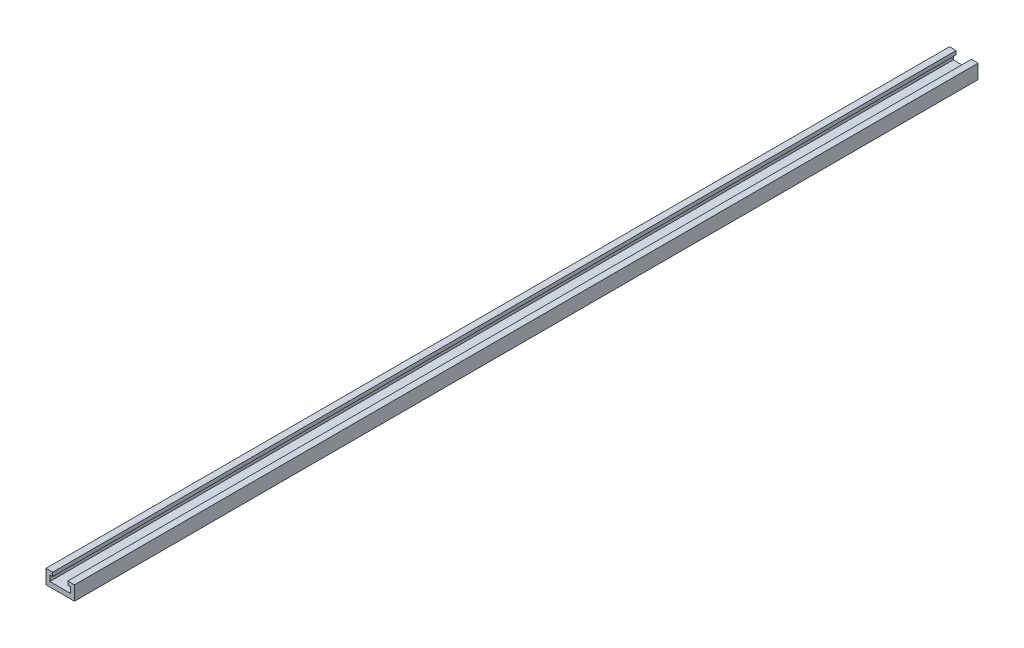
ISO-10303-21;
HEADER;
FILE_DESCRIPTION(('STEP AP214'),'2;1');
FILE_NAME('part.step','',(''),(''),'','','');
FILE_SCHEMA(('AUTOMOTIVE_DESIGN { 1 0 10303 214 1 1 1 1 }'));
ENDSEC;
DATA;
#1=APPLICATION_CONTEXT('core data for automotive mechanical design processes');
#2=APPLICATION_PROTOCOL_DEFINITION('international standard','automotive_design',2000,#1);
#3=PRODUCT_CONTEXT('',#1,'mechanical');
#4=PRODUCT('Part','Part','',(#3));
#5=PRODUCT_RELATED_PRODUCT_CATEGORY('part','',(#4));
#6=PRODUCT_DEFINITION_FORMATION('','',#4);
#7=PRODUCT_DEFINITION_CONTEXT('part definition',#1,'design');
#8=PRODUCT_DEFINITION('design','',#6,#7);
#9=PRODUCT_DEFINITION_SHAPE('','',#8);
#10=(LENGTH_UNIT() NAMED_UNIT(*) SI_UNIT(.MILLI.,.METRE.));
#11=(NAMED_UNIT(*) PLANE_ANGLE_UNIT() SI_UNIT($,.RADIAN.));
#12=(NAMED_UNIT(*) SI_UNIT($,.STERADIAN.) SOLID_ANGLE_UNIT());
#13=UNCERTAINTY_MEASURE_WITH_UNIT(LENGTH_MEASURE(1.E-05),#10,'distance_accuracy_value','');
#14=(GEOMETRIC_REPRESENTATION_CONTEXT(3) GLOBAL_UNCERTAINTY_ASSIGNED_CONTEXT((#13)) GLOBAL_UNIT_ASSIGNED_CONTEXT((#10,
#11,#12)) REPRESENTATION_CONTEXT('',''));
#15=CARTESIAN_POINT('',(0.,0.,0.));
#16=DIRECTION('',(0.,0.,1.));
#17=DIRECTION('',(1.,0.,0.));
#18=AXIS2_PLACEMENT_3D('',#15,#16,#17);
#19=CARTESIAN_POINT('',(0.,0.,301.625));
#20=DIRECTION('',(1.,0.,0.));
#21=DIRECTION('',(0.,0.,-1.));
#22=AXIS2_PLACEMENT_3D('',#19,#20,#21);
#23=PLANE('',#22);
#24=DIRECTION('',(0.,-1.,0.));
#25=VECTOR('',#24,1.);
#26=CARTESIAN_POINT('',(0.,0.,-301.625));
#27=LINE('',#26,#25);
#28=CARTESIAN_POINT('',(0.,9.525,-301.625));
#29=VERTEX_POINT('',#28);
#30=CARTESIAN_POINT('',(0.,0.,-301.625));
#31=VERTEX_POINT('',#30);
#32=EDGE_CURVE('E155',#29,#31,#27,.T.);
#33=ORIENTED_EDGE('',*,*,#32,.T.);
#34=DIRECTION('',(0.,0.,-1.));
#35=VECTOR('',#34,1.);
#36=CARTESIAN_POINT('',(0.,0.,301.625));
#37=LINE('',#36,#35);
#38=CARTESIAN_POINT('',(0.,0.,301.625));
#39=VERTEX_POINT('',#38);
#40=EDGE_CURVE('E11',#39,#31,#37,.T.);
#41=ORIENTED_EDGE('',*,*,#40,.F.);
#42=DIRECTION('',(0.,-1.,0.));
#43=VECTOR('',#42,1.);
#44=CARTESIAN_POINT('',(0.,0.,301.625));
#45=LINE('',#44,#43);
#46=CARTESIAN_POINT('',(0.,9.525,301.625));
#47=VERTEX_POINT('',#46);
#48=EDGE_CURVE('E178',#47,#39,#45,.T.);
#49=ORIENTED_EDGE('',*,*,#48,.F.);
#50=DIRECTION('',(0.,0.,-1.));
#51=VECTOR('',#50,1.);
#52=CARTESIAN_POINT('',(0.,9.525,301.625));
#53=LINE('',#52,#51);
#54=EDGE_CURVE('E151',#47,#29,#53,.T.);
#55=ORIENTED_EDGE('',*,*,#54,.T.);
#56=EDGE_LOOP('',(#33,#41,#49,#55));
#57=FACE_BOUND('',#56,.T.);
#58=ADVANCED_FACE('F34',(#57),#23,.F.);
#59=CARTESIAN_POINT('',(0.,0.,301.625));
#60=DIRECTION('',(0.,1.,0.));
#61=DIRECTION('',(0.,0.,1.));
#62=AXIS2_PLACEMENT_3D('',#59,#60,#61);
#63=PLANE('',#62);
#64=DIRECTION('',(1.,0.,0.));
#65=VECTOR('',#64,1.);
#66=CARTESIAN_POINT('',(0.,0.,-301.625));
#67=LINE('',#66,#65);
#68=CARTESIAN_POINT('',(19.05,0.,-301.625));
#69=VERTEX_POINT('',#68);
#70=EDGE_CURVE('E158',#31,#69,#67,.T.);
#71=ORIENTED_EDGE('',*,*,#70,.T.);
#72=DIRECTION('',(0.,0.,-1.));
#73=VECTOR('',#72,1.);
#74=CARTESIAN_POINT('',(19.05,0.,301.625));
#75=LINE('',#74,#73);
#76=CARTESIAN_POINT('',(19.05,0.,301.625));
#77=VERTEX_POINT('',#76);
#78=EDGE_CURVE('E42',#77,#69,#75,.T.);
#79=ORIENTED_EDGE('',*,*,#78,.F.);
#80=DIRECTION('',(1.,0.,0.));
#81=VECTOR('',#80,1.);
#82=CARTESIAN_POINT('',(0.,0.,301.625));
#83=LINE('',#82,#81);
#84=EDGE_CURVE('E105',#39,#77,#83,.T.);
#85=ORIENTED_EDGE('',*,*,#84,.F.);
#86=ORIENTED_EDGE('',*,*,#40,.T.);
#87=EDGE_LOOP('',(#71,#79,#85,#86));
#88=FACE_BOUND('',#87,.T.);
#89=ADVANCED_FACE('F259',(#88),#63,.F.);
#90=CARTESIAN_POINT('',(19.05,0.,301.625));
#91=DIRECTION('',(-1.,0.,0.));
#92=DIRECTION('',(0.,-1.,0.));
#93=AXIS2_PLACEMENT_3D('',#90,#91,#92);
#94=PLANE('',#93);
#95=DIRECTION('',(0.,1.,0.));
#96=VECTOR('',#95,1.);
#97=CARTESIAN_POINT('',(19.05,0.,-301.625));
#98=LINE('',#97,#96);
#99=CARTESIAN_POINT('',(19.05,9.525,-301.625));
#100=VERTEX_POINT('',#99);
#101=EDGE_CURVE('E161',#69,#100,#98,.T.);
#102=ORIENTED_EDGE('',*,*,#101,.T.);
#103=DIRECTION('',(0.,0.,-1.));
#104=VECTOR('',#103,1.);
#105=CARTESIAN_POINT('',(19.05,9.525,301.625));
#106=LINE('',#105,#104);
#107=CARTESIAN_POINT('',(19.05,9.525,301.625));
#108=VERTEX_POINT('',#107);
#109=EDGE_CURVE('E200',#108,#100,#106,.T.);
#110=ORIENTED_EDGE('',*,*,#109,.F.);
#111=DIRECTION('',(0.,1.,0.));
#112=VECTOR('',#111,1.);
#113=CARTESIAN_POINT('',(19.05,0.,301.625));
#114=LINE('',#113,#112);
#115=EDGE_CURVE('E208',#77,#108,#114,.T.);
#116=ORIENTED_EDGE('',*,*,#115,.F.);
#117=ORIENTED_EDGE('',*,*,#78,.T.);
#118=EDGE_LOOP('',(#102,#110,#116,#117));
#119=FACE_BOUND('',#118,.T.);
#120=ADVANCED_FACE('F206',(#119),#94,.F.);
#121=CARTESIAN_POINT('',(14.605,9.525,301.625));
#122=DIRECTION('',(0.,-1.,0.));
#123=DIRECTION('',(0.,0.,-1.));
#124=AXIS2_PLACEMENT_3D('',#121,#122,#123);
#125=PLANE('',#124);
#126=DIRECTION('',(-1.,0.,0.));
#127=VECTOR('',#126,1.);
#128=CARTESIAN_POINT('',(14.605,9.525,-301.625));
#129=LINE('',#128,#127);
#130=CARTESIAN_POINT('',(14.605,9.525,-301.625));
#131=VERTEX_POINT('',#130);
#132=EDGE_CURVE('E163',#100,#131,#129,.T.);
#133=ORIENTED_EDGE('',*,*,#132,.T.);
#134=DIRECTION('',(0.,0.,-1.));
#135=VECTOR('',#134,1.);
#136=CARTESIAN_POINT('',(14.605,9.525,301.625));
#137=LINE('',#136,#135);
#138=CARTESIAN_POINT('',(14.605,9.525,301.625));
#139=VERTEX_POINT('',#138);
#140=EDGE_CURVE('E197',#139,#131,#137,.T.);
#141=ORIENTED_EDGE('',*,*,#140,.F.);
#142=DIRECTION('',(-1.,0.,0.));
#143=VECTOR('',#142,1.);
#144=CARTESIAN_POINT('',(14.605,9.525,301.625));
#145=LINE('',#144,#143);
#146=EDGE_CURVE('E226',#108,#139,#145,.T.);
#147=ORIENTED_EDGE('',*,*,#146,.F.);
#148=ORIENTED_EDGE('',*,*,#109,.T.);
#149=EDGE_LOOP('',(#133,#141,#147,#148));
#150=FACE_BOUND('',#149,.T.);
#151=ADVANCED_FACE('F217',(#150),#125,.F.);
#152=CARTESIAN_POINT('',(14.605,9.525,301.625));
#153=DIRECTION('',(1.,0.,0.));
#154=DIRECTION('',(0.,0.,-1.));
#155=AXIS2_PLACEMENT_3D('',#152,#153,#154);
#156=PLANE('',#155);
#157=DIRECTION('',(0.,-1.,0.));
#158=VECTOR('',#157,1.);
#159=CARTESIAN_POINT('',(14.605,9.525,-301.625));
#160=LINE('',#159,#158);
#161=CARTESIAN_POINT('',(14.605,6.985,-301.625));
#162=VERTEX_POINT('',#161);
#163=EDGE_CURVE('E165',#131,#162,#160,.T.);
#164=ORIENTED_EDGE('',*,*,#163,.T.);
#165=DIRECTION('',(0.,0.,-1.));
#166=VECTOR('',#165,1.);
#167=CARTESIAN_POINT('',(14.605,6.985,301.625));
#168=LINE('',#167,#166);
#169=CARTESIAN_POINT('',(14.605,6.985,301.625));
#170=VERTEX_POINT('',#169);
#171=EDGE_CURVE('E194',#170,#162,#168,.T.);
#172=ORIENTED_EDGE('',*,*,#171,.F.);
#173=DIRECTION('',(0.,-1.,0.));
#174=VECTOR('',#173,1.);
#175=CARTESIAN_POINT('',(14.605,9.525,301.625));
#176=LINE('',#175,#174);
#177=EDGE_CURVE('E223',#139,#170,#176,.T.);
#178=ORIENTED_EDGE('',*,*,#177,.F.);
#179=ORIENTED_EDGE('',*,*,#140,.T.);
#180=EDGE_LOOP('',(#164,#172,#178,#179));
#181=FACE_BOUND('',#180,.T.);
#182=ADVANCED_FACE('F221',(#181),#156,.F.);
#183=CARTESIAN_POINT('',(14.605,6.985,301.625));
#184=DIRECTION('',(0.,1.,0.));
#185=DIRECTION('',(0.,0.,1.));
#186=AXIS2_PLACEMENT_3D('',#183,#184,#185);
#187=PLANE('',#186);
#188=DIRECTION('',(1.,0.,0.));
#189=VECTOR('',#188,1.);
#190=CARTESIAN_POINT('',(14.605,6.985,-301.625));
#191=LINE('',#190,#189);
#192=CARTESIAN_POINT('',(16.51,6.985,-301.625));
#193=VERTEX_POINT('',#192);
#194=EDGE_CURVE('E167',#162,#193,#191,.T.);
#195=ORIENTED_EDGE('',*,*,#194,.T.);
#196=DIRECTION('',(0.,0.,-1.));
#197=VECTOR('',#196,1.);
#198=CARTESIAN_POINT('',(16.51,6.985,301.625));
#199=LINE('',#198,#197);
#200=CARTESIAN_POINT('',(16.51,6.985,301.625));
#201=VERTEX_POINT('',#200);
#202=EDGE_CURVE('E191',#201,#193,#199,.T.);
#203=ORIENTED_EDGE('',*,*,#202,.F.);
#204=DIRECTION('',(1.,0.,0.));
#205=VECTOR('',#204,1.);
#206=CARTESIAN_POINT('',(14.605,6.985,301.625));
#207=LINE('',#206,#205);
#208=EDGE_CURVE('E225',#170,#201,#207,.T.);
#209=ORIENTED_EDGE('',*,*,#208,.F.);
#210=ORIENTED_EDGE('',*,*,#171,.T.);
#211=EDGE_LOOP('',(#195,#203,#209,#210));
#212=FACE_BOUND('',#211,.T.);
#213=ADVANCED_FACE('F272',(#212),#187,.F.);
#214=CARTESIAN_POINT('',(16.51,6.985,301.625));
#215=DIRECTION('',(1.,0.,0.));
#216=DIRECTION('',(0.,0.,-1.));
#217=AXIS2_PLACEMENT_3D('',#214,#215,#216);
#218=PLANE('',#217);
#219=DIRECTION('',(0.,-1.,0.));
#220=VECTOR('',#219,1.);
#221=CARTESIAN_POINT('',(16.51,6.985,-301.625));
#222=LINE('',#221,#220);
#223=CARTESIAN_POINT('',(16.51,3.175,-301.625));
#224=VERTEX_POINT('',#223);
#225=EDGE_CURVE('E169',#193,#224,#222,.T.);
#226=ORIENTED_EDGE('',*,*,#225,.T.);
#227=DIRECTION('',(0.,0.,-1.));
#228=VECTOR('',#227,1.);
#229=CARTESIAN_POINT('',(16.51,3.175,301.625));
#230=LINE('',#229,#228);
#231=CARTESIAN_POINT('',(16.51,3.175,301.625));
#232=VERTEX_POINT('',#231);
#233=EDGE_CURVE('E188',#232,#224,#230,.T.);
#234=ORIENTED_EDGE('',*,*,#233,.F.);
#235=DIRECTION('',(0.,-1.,0.));
#236=VECTOR('',#235,1.);
#237=CARTESIAN_POINT('',(16.51,6.985,301.625));
#238=LINE('',#237,#236);
#239=EDGE_CURVE('E228',#201,#232,#238,.T.);
#240=ORIENTED_EDGE('',*,*,#239,.F.);
#241=ORIENTED_EDGE('',*,*,#202,.T.);
#242=EDGE_LOOP('',(#226,#234,#240,#241));
#243=FACE_BOUND('',#242,.T.);
#244=ADVANCED_FACE('F275',(#243),#218,.F.);
#245=CARTESIAN_POINT('',(2.54,3.175,301.625));
#246=DIRECTION('',(0.,-1.,0.));
#247=DIRECTION('',(0.,0.,-1.));
#248=AXIS2_PLACEMENT_3D('',#245,#246,#247);
#249=PLANE('',#248);
#250=DIRECTION('',(-1.,0.,0.));
#251=VECTOR('',#250,1.);
#252=CARTESIAN_POINT('',(2.54,3.175,-301.625));
#253=LINE('',#252,#251);
#254=CARTESIAN_POINT('',(2.54,3.175,-301.625));
#255=VERTEX_POINT('',#254);
#256=EDGE_CURVE('E171',#224,#255,#253,.T.);
#257=ORIENTED_EDGE('',*,*,#256,.T.);
#258=DIRECTION('',(0.,0.,-1.));
#259=VECTOR('',#258,1.);
#260=CARTESIAN_POINT('',(2.54,3.175,301.625));
#261=LINE('',#260,#259);
#262=CARTESIAN_POINT('',(2.54,3.175,301.625));
#263=VERTEX_POINT('',#262);
#264=EDGE_CURVE('E185',#263,#255,#261,.T.);
#265=ORIENTED_EDGE('',*,*,#264,.F.);
#266=DIRECTION('',(-1.,0.,0.));
#267=VECTOR('',#266,1.);
#268=CARTESIAN_POINT('',(2.54,3.175,301.625));
#269=LINE('',#268,#267);
#270=EDGE_CURVE('E234',#232,#263,#269,.T.);
#271=ORIENTED_EDGE('',*,*,#270,.F.);
#272=ORIENTED_EDGE('',*,*,#233,.T.);
#273=EDGE_LOOP('',(#257,#265,#271,#272));
#274=FACE_BOUND('',#273,.T.);
#275=ADVANCED_FACE('F240',(#274),#249,.F.);
#276=CARTESIAN_POINT('',(2.54,6.985,301.625));
#277=DIRECTION('',(-1.,0.,0.));
#278=DIRECTION('',(0.,-1.,0.));
#279=AXIS2_PLACEMENT_3D('',#276,#277,#278);
#280=PLANE('',#279);
#281=DIRECTION('',(0.,1.,0.));
#282=VECTOR('',#281,1.);
#283=CARTESIAN_POINT('',(2.54,6.985,-301.625));
#284=LINE('',#283,#282);
#285=CARTESIAN_POINT('',(2.54,6.985,-301.625));
#286=VERTEX_POINT('',#285);
#287=EDGE_CURVE('E173',#255,#286,#284,.T.);
#288=ORIENTED_EDGE('',*,*,#287,.T.);
#289=DIRECTION('',(0.,0.,-1.));
#290=VECTOR('',#289,1.);
#291=CARTESIAN_POINT('',(2.54,6.985,301.625));
#292=LINE('',#291,#290);
#293=CARTESIAN_POINT('',(2.54,6.985,301.625));
#294=VERTEX_POINT('',#293);
#295=EDGE_CURVE('E146',#294,#286,#292,.T.);
#296=ORIENTED_EDGE('',*,*,#295,.F.);
#297=DIRECTION('',(0.,1.,0.));
#298=VECTOR('',#297,1.);
#299=CARTESIAN_POINT('',(2.54,6.985,301.625));
#300=LINE('',#299,#298);
#301=EDGE_CURVE('E136',#263,#294,#300,.T.);
#302=ORIENTED_EDGE('',*,*,#301,.F.);
#303=ORIENTED_EDGE('',*,*,#264,.T.);
#304=EDGE_LOOP('',(#288,#296,#302,#303));
#305=FACE_BOUND('',#304,.T.);
#306=ADVANCED_FACE('F244',(#305),#280,.F.);
#307=CARTESIAN_POINT('',(4.445,6.985,301.625));
#308=DIRECTION('',(0.,1.,0.));
#309=DIRECTION('',(0.,0.,1.));
#310=AXIS2_PLACEMENT_3D('',#307,#308,#309);
#311=PLANE('',#310);
#312=DIRECTION('',(1.,0.,0.));
#313=VECTOR('',#312,1.);
#314=CARTESIAN_POINT('',(4.445,6.985,-301.625));
#315=LINE('',#314,#313);
#316=CARTESIAN_POINT('',(4.445,6.985,-301.625));
#317=VERTEX_POINT('',#316);
#318=EDGE_CURVE('E144',#286,#317,#315,.T.);
#319=ORIENTED_EDGE('',*,*,#318,.T.);
#320=DIRECTION('',(0.,0.,-1.));
#321=VECTOR('',#320,1.);
#322=CARTESIAN_POINT('',(4.445,6.985,301.625));
#323=LINE('',#322,#321);
#324=CARTESIAN_POINT('',(4.445,6.985,301.625));
#325=VERTEX_POINT('',#324);
#326=EDGE_CURVE('E141',#325,#317,#323,.T.);
#327=ORIENTED_EDGE('',*,*,#326,.F.);
#328=DIRECTION('',(1.,0.,0.));
#329=VECTOR('',#328,1.);
#330=CARTESIAN_POINT('',(4.445,6.985,301.625));
#331=LINE('',#330,#329);
#332=EDGE_CURVE('E130',#294,#325,#331,.T.);
#333=ORIENTED_EDGE('',*,*,#332,.F.);
#334=ORIENTED_EDGE('',*,*,#295,.T.);
#335=EDGE_LOOP('',(#319,#327,#333,#334));
#336=FACE_BOUND('',#335,.T.);
#337=ADVANCED_FACE('F142',(#336),#311,.F.);
#338=CARTESIAN_POINT('',(4.445,9.525,301.625));
#339=DIRECTION('',(-1.,0.,0.));
#340=DIRECTION('',(0.,0.,1.));
#341=AXIS2_PLACEMENT_3D('',#338,#339,#340);
#342=PLANE('',#341);
#343=DIRECTION('',(0.,1.,0.));
#344=VECTOR('',#343,1.);
#345=CARTESIAN_POINT('',(4.445,9.525,-301.625));
#346=LINE('',#345,#344);
#347=CARTESIAN_POINT('',(4.445,9.525,-301.625));
#348=VERTEX_POINT('',#347);
#349=EDGE_CURVE('E91',#317,#348,#346,.T.);
#350=ORIENTED_EDGE('',*,*,#349,.T.);
#351=DIRECTION('',(0.,0.,-1.));
#352=VECTOR('',#351,1.);
#353=CARTESIAN_POINT('',(4.445,9.525,301.625));
#354=LINE('',#353,#352);
#355=CARTESIAN_POINT('',(4.445,9.525,301.625));
#356=VERTEX_POINT('',#355);
#357=EDGE_CURVE('E147',#356,#348,#354,.T.);
#358=ORIENTED_EDGE('',*,*,#357,.F.);
#359=DIRECTION('',(0.,1.,0.));
#360=VECTOR('',#359,1.);
#361=CARTESIAN_POINT('',(4.445,9.525,301.625));
#362=LINE('',#361,#360);
#363=EDGE_CURVE('E134',#325,#356,#362,.T.);
#364=ORIENTED_EDGE('',*,*,#363,.F.);
#365=ORIENTED_EDGE('',*,*,#326,.T.);
#366=EDGE_LOOP('',(#350,#358,#364,#365));
#367=FACE_BOUND('',#366,.T.);
#368=ADVANCED_FACE('F149',(#367),#342,.F.);
#369=CARTESIAN_POINT('',(0.,9.525,301.625));
#370=DIRECTION('',(0.,-1.,0.));
#371=DIRECTION('',(0.,0.,-1.));
#372=AXIS2_PLACEMENT_3D('',#369,#370,#371);
#373=PLANE('',#372);
#374=DIRECTION('',(-1.,0.,0.));
#375=VECTOR('',#374,1.);
#376=CARTESIAN_POINT('',(0.,9.525,-301.625));
#377=LINE('',#376,#375);
#378=EDGE_CURVE('E97',#348,#29,#377,.T.);
#379=ORIENTED_EDGE('',*,*,#378,.T.);
#380=ORIENTED_EDGE('',*,*,#54,.F.);
#381=DIRECTION('',(-1.,0.,0.));
#382=VECTOR('',#381,1.);
#383=CARTESIAN_POINT('',(0.,9.525,301.625));
#384=LINE('',#383,#382);
#385=EDGE_CURVE('E50',#356,#47,#384,.T.);
#386=ORIENTED_EDGE('',*,*,#385,.F.);
#387=ORIENTED_EDGE('',*,*,#357,.T.);
#388=EDGE_LOOP('',(#379,#380,#386,#387));
#389=FACE_BOUND('',#388,.T.);
#390=ADVANCED_FACE('F248',(#389),#373,.F.);
#391=CARTESIAN_POINT('',(0.,0.,301.625));
#392=DIRECTION('',(0.,0.,-1.));
#393=DIRECTION('',(-1.,0.,0.));
#394=AXIS2_PLACEMENT_3D('',#391,#392,#393);
#395=PLANE('',#394);
#396=ORIENTED_EDGE('',*,*,#48,.T.);
#397=ORIENTED_EDGE('',*,*,#84,.T.);
#398=ORIENTED_EDGE('',*,*,#115,.T.);
#399=ORIENTED_EDGE('',*,*,#146,.T.);
#400=ORIENTED_EDGE('',*,*,#177,.T.);
#401=ORIENTED_EDGE('',*,*,#208,.T.);
#402=ORIENTED_EDGE('',*,*,#239,.T.);
#403=ORIENTED_EDGE('',*,*,#270,.T.);
#404=ORIENTED_EDGE('',*,*,#301,.T.);
#405=ORIENTED_EDGE('',*,*,#332,.T.);
#406=ORIENTED_EDGE('',*,*,#363,.T.);
#407=ORIENTED_EDGE('',*,*,#385,.T.);
#408=EDGE_LOOP('',(#396,#397,#398,#399,#400,#401,#402,#403,#404,#405,#406,#407));
#409=FACE_BOUND('',#408,.T.);
#410=ADVANCED_FACE('F132',(#409),#395,.F.);
#411=CARTESIAN_POINT('',(0.,0.,-301.625));
#412=DIRECTION('',(0.,0.,-1.));
#413=DIRECTION('',(-1.,0.,0.));
#414=AXIS2_PLACEMENT_3D('',#411,#412,#413);
#415=PLANE('',#414);
#416=ORIENTED_EDGE('',*,*,#32,.F.);
#417=ORIENTED_EDGE('',*,*,#378,.F.);
#418=ORIENTED_EDGE('',*,*,#349,.F.);
#419=ORIENTED_EDGE('',*,*,#318,.F.);
#420=ORIENTED_EDGE('',*,*,#287,.F.);
#421=ORIENTED_EDGE('',*,*,#256,.F.);
#422=ORIENTED_EDGE('',*,*,#225,.F.);
#423=ORIENTED_EDGE('',*,*,#194,.F.);
#424=ORIENTED_EDGE('',*,*,#163,.F.);
#425=ORIENTED_EDGE('',*,*,#132,.F.);
#426=ORIENTED_EDGE('',*,*,#101,.F.);
#427=ORIENTED_EDGE('',*,*,#70,.F.);
#428=EDGE_LOOP('',(#416,#417,#418,#419,#420,#421,#422,#423,#424,#425,#426,#427));
#429=FACE_BOUND('',#428,.T.);
#430=ADVANCED_FACE('F212',(#429),#415,.T.);
#431=CLOSED_SHELL('',(#58,#89,#120,#151,#182,#213,#244,#275,#306,#337,#368,#390,#410,#430));
#432=MANIFOLD_SOLID_BREP('B2',#431);
#433=ADVANCED_BREP_SHAPE_REPRESENTATION('',(#18,#432),#14);
#434=SHAPE_DEFINITION_REPRESENTATION(#9,#433);
ENDSEC;
END-ISO-10303-21;
